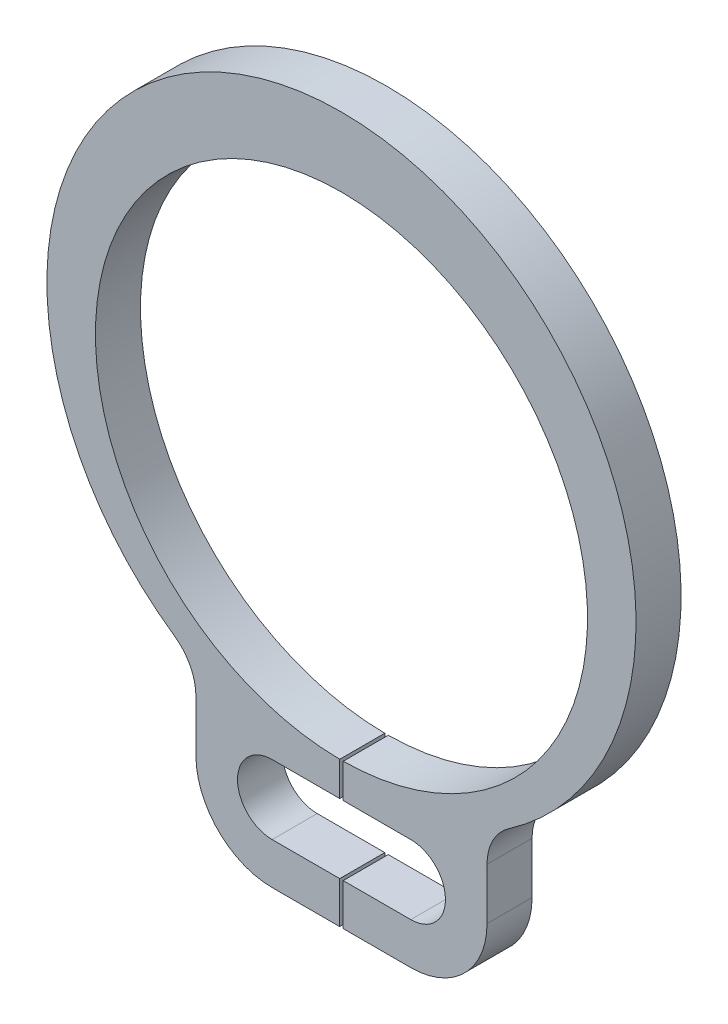
ISO-10303-21;
HEADER;
FILE_DESCRIPTION(('STEP AP214'),'2;1');
FILE_NAME('part.step','',(''),(''),'','','');
FILE_SCHEMA(('AUTOMOTIVE_DESIGN { 1 0 10303 214 1 1 1 1 }'));
ENDSEC;
DATA;
#1=APPLICATION_CONTEXT('core data for automotive mechanical design processes');
#2=APPLICATION_PROTOCOL_DEFINITION('international standard','automotive_design',2000,#1);
#3=PRODUCT_CONTEXT('',#1,'mechanical');
#4=PRODUCT('Part','Part','',(#3));
#5=PRODUCT_RELATED_PRODUCT_CATEGORY('part','',(#4));
#6=PRODUCT_DEFINITION_FORMATION('','',#4);
#7=PRODUCT_DEFINITION_CONTEXT('part definition',#1,'design');
#8=PRODUCT_DEFINITION('design','',#6,#7);
#9=PRODUCT_DEFINITION_SHAPE('','',#8);
#10=(LENGTH_UNIT() NAMED_UNIT(*) SI_UNIT(.MILLI.,.METRE.));
#11=(NAMED_UNIT(*) PLANE_ANGLE_UNIT() SI_UNIT($,.RADIAN.));
#12=(NAMED_UNIT(*) SI_UNIT($,.STERADIAN.) SOLID_ANGLE_UNIT());
#13=UNCERTAINTY_MEASURE_WITH_UNIT(LENGTH_MEASURE(1.E-05),#10,'distance_accuracy_value','');
#14=(GEOMETRIC_REPRESENTATION_CONTEXT(3) GLOBAL_UNCERTAINTY_ASSIGNED_CONTEXT((#13)) GLOBAL_UNIT_ASSIGNED_CONTEXT((#10,
#11,#12)) REPRESENTATION_CONTEXT('',''));
#15=CARTESIAN_POINT('',(0.,0.,0.));
#16=DIRECTION('',(0.,0.,1.));
#17=DIRECTION('',(1.,0.,0.));
#18=AXIS2_PLACEMENT_3D('',#15,#16,#17);
#19=CARTESIAN_POINT('',(1.,-4.54120028186382,0.65));
#20=DIRECTION('',(0.,0.,-1.));
#21=DIRECTION('',(-1.,0.,0.));
#22=AXIS2_PLACEMENT_3D('',#19,#20,#21);
#23=CYLINDRICAL_SURFACE('',#22,0.5);
#24=CARTESIAN_POINT('',(1.,-4.54120028186382,0.65));
#25=DIRECTION('',(0.,0.,1.));
#26=DIRECTION('',(-1.,0.,0.));
#27=AXIS2_PLACEMENT_3D('',#24,#25,#26);
#28=CIRCLE('',#27,0.5);
#29=CARTESIAN_POINT('',(1.,-5.04120028186382,0.65));
#30=VERTEX_POINT('',#29);
#31=CARTESIAN_POINT('',(1.,-4.04120028186381,0.65));
#32=VERTEX_POINT('',#31);
#33=EDGE_CURVE('E194',#30,#32,#28,.T.);
#34=ORIENTED_EDGE('',*,*,#33,.T.);
#35=DIRECTION('',(0.,0.,1.));
#36=VECTOR('',#35,1.);
#37=CARTESIAN_POINT('',(1.,-4.04120028186381,0.));
#38=LINE('',#37,#36);
#39=CARTESIAN_POINT('',(1.,-4.04120028186381,0.));
#40=VERTEX_POINT('',#39);
#41=EDGE_CURVE('E311',#40,#32,#38,.T.);
#42=ORIENTED_EDGE('',*,*,#41,.F.);
#43=CARTESIAN_POINT('',(1.,-4.54120028186382,0.));
#44=DIRECTION('',(0.,0.,1.));
#45=DIRECTION('',(-1.,0.,0.));
#46=AXIS2_PLACEMENT_3D('',#43,#44,#45);
#47=CIRCLE('',#46,0.5);
#48=CARTESIAN_POINT('',(1.,-5.04120028186382,0.));
#49=VERTEX_POINT('',#48);
#50=EDGE_CURVE('E199',#49,#40,#47,.T.);
#51=ORIENTED_EDGE('',*,*,#50,.F.);
#52=DIRECTION('',(0.,0.,1.));
#53=VECTOR('',#52,1.);
#54=CARTESIAN_POINT('',(1.,-5.04120028186382,0.));
#55=LINE('',#54,#53);
#56=EDGE_CURVE('E187',#49,#30,#55,.T.);
#57=ORIENTED_EDGE('',*,*,#56,.T.);
#58=EDGE_LOOP('',(#34,#42,#51,#57));
#59=FACE_BOUND('',#58,.T.);
#60=ADVANCED_FACE('F32',(#59),#23,.F.);
#61=CARTESIAN_POINT('',(0.025,-5.64120028186382,0.));
#62=DIRECTION('',(1.,0.,0.));
#63=DIRECTION('',(0.,0.,-1.));
#64=AXIS2_PLACEMENT_3D('',#61,#62,#63);
#65=PLANE('',#64);
#66=DIRECTION('',(0.,1.,0.));
#67=VECTOR('',#66,1.);
#68=CARTESIAN_POINT('',(0.025,-5.64120028186382,0.));
#69=LINE('',#68,#67);
#70=CARTESIAN_POINT('',(0.0250000000000001,-4.04120028186381,0.));
#71=VERTEX_POINT('',#70);
#72=CARTESIAN_POINT('',(0.025,-3.54991197073956,0.));
#73=VERTEX_POINT('',#72);
#74=EDGE_CURVE('E319',#71,#73,#69,.T.);
#75=ORIENTED_EDGE('',*,*,#74,.F.);
#76=DIRECTION('',(0.,0.,1.));
#77=VECTOR('',#76,1.);
#78=CARTESIAN_POINT('',(0.025,-4.04120028186381,0.));
#79=LINE('',#78,#77);
#80=CARTESIAN_POINT('',(0.025,-4.04120028186381,0.65));
#81=VERTEX_POINT('',#80);
#82=EDGE_CURVE('E287',#71,#81,#79,.T.);
#83=ORIENTED_EDGE('',*,*,#82,.T.);
#84=DIRECTION('',(0.,1.,0.));
#85=VECTOR('',#84,1.);
#86=CARTESIAN_POINT('',(0.025,-5.64120028186382,0.65));
#87=LINE('',#86,#85);
#88=CARTESIAN_POINT('',(0.025,-3.54991197073956,0.65));
#89=VERTEX_POINT('',#88);
#90=EDGE_CURVE('E290',#81,#89,#87,.T.);
#91=ORIENTED_EDGE('',*,*,#90,.T.);
#92=DIRECTION('',(0.,0.,-1.));
#93=VECTOR('',#92,1.);
#94=CARTESIAN_POINT('',(0.025,-3.54991197073956,0.65));
#95=LINE('',#94,#93);
#96=EDGE_CURVE('E254',#89,#73,#95,.T.);
#97=ORIENTED_EDGE('',*,*,#96,.T.);
#98=EDGE_LOOP('',(#75,#83,#91,#97));
#99=FACE_BOUND('',#98,.T.);
#100=ADVANCED_FACE('F381',(#99),#65,.F.);
#101=CARTESIAN_POINT('',(-0.025,-5.64120028186382,0.));
#102=DIRECTION('',(-1.,0.,0.));
#103=DIRECTION('',(0.,0.,1.));
#104=AXIS2_PLACEMENT_3D('',#101,#102,#103);
#105=PLANE('',#104);
#106=DIRECTION('',(0.,-1.,0.));
#107=VECTOR('',#106,1.);
#108=CARTESIAN_POINT('',(-0.025,-5.64120028186382,0.65));
#109=LINE('',#108,#107);
#110=CARTESIAN_POINT('',(-0.025,-3.54991197073956,0.65));
#111=VERTEX_POINT('',#110);
#112=CARTESIAN_POINT('',(-0.025,-4.04120028186381,0.65));
#113=VERTEX_POINT('',#112);
#114=EDGE_CURVE('E286',#111,#113,#109,.T.);
#115=ORIENTED_EDGE('',*,*,#114,.T.);
#116=DIRECTION('',(0.,0.,-1.));
#117=VECTOR('',#116,1.);
#118=CARTESIAN_POINT('',(-0.025,-4.04120028186381,0.));
#119=LINE('',#118,#117);
#120=CARTESIAN_POINT('',(-0.025,-4.04120028186381,0.));
#121=VERTEX_POINT('',#120);
#122=EDGE_CURVE('E11',#113,#121,#119,.T.);
#123=ORIENTED_EDGE('',*,*,#122,.T.);
#124=DIRECTION('',(0.,-1.,0.));
#125=VECTOR('',#124,1.);
#126=CARTESIAN_POINT('',(-0.025,-5.64120028186382,0.));
#127=LINE('',#126,#125);
#128=CARTESIAN_POINT('',(-0.025,-3.54991197073956,0.));
#129=VERTEX_POINT('',#128);
#130=EDGE_CURVE('E318',#129,#121,#127,.T.);
#131=ORIENTED_EDGE('',*,*,#130,.F.);
#132=DIRECTION('',(0.,0.,-1.));
#133=VECTOR('',#132,1.);
#134=CARTESIAN_POINT('',(-0.025,-3.54991197073956,0.65));
#135=LINE('',#134,#133);
#136=EDGE_CURVE('E257',#129,#111,#135,.F.);
#137=ORIENTED_EDGE('',*,*,#136,.T.);
#138=EDGE_LOOP('',(#115,#123,#131,#137));
#139=FACE_BOUND('',#138,.T.);
#140=ADVANCED_FACE('F374',(#139),#105,.F.);
#141=CARTESIAN_POINT('',(-0.999999999999999,-5.64120028186382,0.65));
#142=DIRECTION('',(0.,1.,0.));
#143=DIRECTION('',(0.,0.,1.));
#144=AXIS2_PLACEMENT_3D('',#141,#142,#143);
#145=PLANE('',#144);
#146=DIRECTION('',(1.,0.,0.));
#147=VECTOR('',#146,1.);
#148=CARTESIAN_POINT('',(-0.999999999999999,-5.64120028186382,0.));
#149=LINE('',#148,#147);
#150=CARTESIAN_POINT('',(-0.999999999999999,-5.64120028186382,0.));
#151=VERTEX_POINT('',#150);
#152=CARTESIAN_POINT('',(-0.025,-5.64120028186382,0.));
#153=VERTEX_POINT('',#152);
#154=EDGE_CURVE('E231',#151,#153,#149,.T.);
#155=ORIENTED_EDGE('',*,*,#154,.T.);
#156=DIRECTION('',(0.,0.,1.));
#157=VECTOR('',#156,1.);
#158=CARTESIAN_POINT('',(-0.025,-5.64120028186382,0.));
#159=LINE('',#158,#157);
#160=CARTESIAN_POINT('',(-0.025,-5.64120028186382,0.65));
#161=VERTEX_POINT('',#160);
#162=EDGE_CURVE('E302',#153,#161,#159,.T.);
#163=ORIENTED_EDGE('',*,*,#162,.T.);
#164=DIRECTION('',(1.,0.,0.));
#165=VECTOR('',#164,1.);
#166=CARTESIAN_POINT('',(-0.999999999999999,-5.64120028186382,0.65));
#167=LINE('',#166,#165);
#168=CARTESIAN_POINT('',(-0.999999999999999,-5.64120028186382,0.65));
#169=VERTEX_POINT('',#168);
#170=EDGE_CURVE('E214',#169,#161,#167,.T.);
#171=ORIENTED_EDGE('',*,*,#170,.F.);
#172=DIRECTION('',(0.,0.,-1.));
#173=VECTOR('',#172,1.);
#174=CARTESIAN_POINT('',(-0.999999999999999,-5.64120028186382,0.65));
#175=LINE('',#174,#173);
#176=EDGE_CURVE('E251',#169,#151,#175,.T.);
#177=ORIENTED_EDGE('',*,*,#176,.T.);
#178=EDGE_LOOP('',(#155,#163,#171,#177));
#179=FACE_BOUND('',#178,.T.);
#180=ADVANCED_FACE('F322',(#179),#145,.F.);
#181=CARTESIAN_POINT('',(-0.999999999999999,-4.54120028186382,0.65));
#182=DIRECTION('',(0.,0.,1.));
#183=DIRECTION('',(1.,0.,0.));
#184=AXIS2_PLACEMENT_3D('',#181,#182,#183);
#185=PLANE('',#184);
#186=DIRECTION('',(-1.,0.,0.));
#187=VECTOR('',#186,1.);
#188=CARTESIAN_POINT('',(-0.999999999999999,-4.04120028186381,0.65));
#189=LINE('',#188,#187);
#190=EDGE_CURVE('E47',#32,#81,#189,.T.);
#191=ORIENTED_EDGE('',*,*,#190,.F.);
#192=ORIENTED_EDGE('',*,*,#33,.F.);
#193=DIRECTION('',(1.,0.,0.));
#194=VECTOR('',#193,1.);
#195=CARTESIAN_POINT('',(-0.999999999999999,-5.04120028186382,0.65));
#196=LINE('',#195,#194);
#197=CARTESIAN_POINT('',(0.0250000000000001,-5.04120028186382,0.65));
#198=VERTEX_POINT('',#197);
#199=EDGE_CURVE('E364',#198,#30,#196,.T.);
#200=ORIENTED_EDGE('',*,*,#199,.F.);
#201=CARTESIAN_POINT('',(0.025,-5.64120028186382,0.65));
#202=VERTEX_POINT('',#201);
#203=EDGE_CURVE('E297',#202,#198,#87,.T.);
#204=ORIENTED_EDGE('',*,*,#203,.F.);
#205=CARTESIAN_POINT('',(1.,-5.64120028186382,0.65));
#206=VERTEX_POINT('',#205);
#207=EDGE_CURVE('E212',#202,#206,#167,.T.);
#208=ORIENTED_EDGE('',*,*,#207,.T.);
#209=CARTESIAN_POINT('',(1.,-4.54120028186382,0.65));
#210=DIRECTION('',(0.,0.,1.));
#211=DIRECTION('',(-1.,0.,0.));
#212=AXIS2_PLACEMENT_3D('',#209,#210,#211);
#213=CIRCLE('',#212,1.1);
#214=CARTESIAN_POINT('',(2.1,-4.54120028186381,0.65));
#215=VERTEX_POINT('',#214);
#216=EDGE_CURVE('E217',#206,#215,#213,.T.);
#217=ORIENTED_EDGE('',*,*,#216,.T.);
#218=DIRECTION('',(0.,1.,0.));
#219=VECTOR('',#218,1.);
#220=CARTESIAN_POINT('',(2.1,-4.54120028186381,0.65));
#221=LINE('',#220,#219);
#222=CARTESIAN_POINT('',(2.1,-3.79949183842746,0.65));
#223=VERTEX_POINT('',#222);
#224=EDGE_CURVE('E219',#215,#223,#221,.T.);
#225=ORIENTED_EDGE('',*,*,#224,.T.);
#226=CARTESIAN_POINT('',(2.83333333333333,-3.79949183842746,0.65));
#227=DIRECTION('',(0.,0.,1.));
#228=DIRECTION('',(1.,0.,0.));
#229=AXIS2_PLACEMENT_3D('',#226,#227,#228);
#230=CIRCLE('',#229,0.733333333333333);
#231=CARTESIAN_POINT('',(2.41638795986622,-3.19622213645151,0.65));
#232=VERTEX_POINT('',#231);
#233=EDGE_CURVE('E271',#223,#232,#230,.F.);
#234=ORIENTED_EDGE('',*,*,#233,.T.);
#235=CARTESIAN_POINT('',(0.,0.3,0.65));
#236=DIRECTION('',(0.,0.,1.));
#237=DIRECTION('',(1.,0.,0.));
#238=AXIS2_PLACEMENT_3D('',#235,#236,#237);
#239=CIRCLE('',#238,4.25);
#240=CARTESIAN_POINT('',(-2.41638795986622,-3.19622213645151,0.65));
#241=VERTEX_POINT('',#240);
#242=EDGE_CURVE('E222',#232,#241,#239,.T.);
#243=ORIENTED_EDGE('',*,*,#242,.T.);
#244=CARTESIAN_POINT('',(-2.83333333333333,-3.79949183842746,0.65));
#245=DIRECTION('',(0.,0.,1.));
#246=DIRECTION('',(1.,0.,0.));
#247=AXIS2_PLACEMENT_3D('',#244,#245,#246);
#248=CIRCLE('',#247,0.733333333333333);
#249=CARTESIAN_POINT('',(-2.1,-3.79949183842746,0.65));
#250=VERTEX_POINT('',#249);
#251=EDGE_CURVE('E275',#241,#250,#248,.F.);
#252=ORIENTED_EDGE('',*,*,#251,.T.);
#253=DIRECTION('',(0.,-1.,0.));
#254=VECTOR('',#253,1.);
#255=CARTESIAN_POINT('',(-2.1,-4.54120028186382,0.65));
#256=LINE('',#255,#254);
#257=CARTESIAN_POINT('',(-2.1,-4.54120028186382,0.65));
#258=VERTEX_POINT('',#257);
#259=EDGE_CURVE('E225',#250,#258,#256,.T.);
#260=ORIENTED_EDGE('',*,*,#259,.T.);
#261=CARTESIAN_POINT('',(-0.999999999999999,-4.54120028186382,0.65));
#262=DIRECTION('',(0.,0.,1.));
#263=DIRECTION('',(1.,0.,0.));
#264=AXIS2_PLACEMENT_3D('',#261,#262,#263);
#265=CIRCLE('',#264,1.1);
#266=EDGE_CURVE('E209',#258,#169,#265,.T.);
#267=ORIENTED_EDGE('',*,*,#266,.T.);
#268=ORIENTED_EDGE('',*,*,#170,.T.);
#269=CARTESIAN_POINT('',(-0.025,-5.04120028186382,0.65));
#270=VERTEX_POINT('',#269);
#271=EDGE_CURVE('E280',#270,#161,#109,.T.);
#272=ORIENTED_EDGE('',*,*,#271,.F.);
#273=CARTESIAN_POINT('',(-0.999999999999999,-5.04120028186382,0.65));
#274=VERTEX_POINT('',#273);
#275=EDGE_CURVE('E285',#274,#270,#196,.T.);
#276=ORIENTED_EDGE('',*,*,#275,.F.);
#277=CARTESIAN_POINT('',(-0.999999999999999,-4.54120028186382,0.65));
#278=DIRECTION('',(0.,0.,1.));
#279=DIRECTION('',(1.,0.,0.));
#280=AXIS2_PLACEMENT_3D('',#277,#278,#279);
#281=CIRCLE('',#280,0.5);
#282=CARTESIAN_POINT('',(-0.999999999999999,-4.04120028186381,0.65));
#283=VERTEX_POINT('',#282);
#284=EDGE_CURVE('E186',#283,#274,#281,.T.);
#285=ORIENTED_EDGE('',*,*,#284,.F.);
#286=EDGE_CURVE('E366',#113,#283,#189,.T.);
#287=ORIENTED_EDGE('',*,*,#286,.F.);
#288=ORIENTED_EDGE('',*,*,#114,.F.);
#289=CARTESIAN_POINT('',(0.,0.,0.65));
#290=DIRECTION('',(0.,0.,1.));
#291=DIRECTION('',(1.,0.,0.));
#292=AXIS2_PLACEMENT_3D('',#289,#290,#291);
#293=CIRCLE('',#292,3.55);
#294=EDGE_CURVE('E203',#89,#111,#293,.T.);
#295=ORIENTED_EDGE('',*,*,#294,.F.);
#296=ORIENTED_EDGE('',*,*,#90,.F.);
#297=EDGE_LOOP('',(#191,#192,#200,#204,#208,#217,#225,#234,#243,#252,#260,#267,#268,#272,#276,
#285,#287,#288,#295,#296));
#298=FACE_BOUND('',#297,.T.);
#299=ADVANCED_FACE('F284',(#298),#185,.T.);
#300=CARTESIAN_POINT('',(-0.999999999999999,-4.54120028186382,0.));
#301=DIRECTION('',(0.,0.,1.));
#302=DIRECTION('',(1.,0.,0.));
#303=AXIS2_PLACEMENT_3D('',#300,#301,#302);
#304=PLANE('',#303);
#305=ORIENTED_EDGE('',*,*,#50,.T.);
#306=DIRECTION('',(-1.,0.,0.));
#307=VECTOR('',#306,1.);
#308=CARTESIAN_POINT('',(-0.999999999999999,-4.04120028186381,0.));
#309=LINE('',#308,#307);
#310=EDGE_CURVE('E188',#40,#71,#309,.T.);
#311=ORIENTED_EDGE('',*,*,#310,.T.);
#312=ORIENTED_EDGE('',*,*,#74,.T.);
#313=CARTESIAN_POINT('',(0.,0.,0.));
#314=DIRECTION('',(0.,0.,1.));
#315=DIRECTION('',(1.,0.,0.));
#316=AXIS2_PLACEMENT_3D('',#313,#314,#315);
#317=CIRCLE('',#316,3.55);
#318=EDGE_CURVE('E196',#73,#129,#317,.T.);
#319=ORIENTED_EDGE('',*,*,#318,.T.);
#320=ORIENTED_EDGE('',*,*,#130,.T.);
#321=CARTESIAN_POINT('',(-0.999999999999999,-4.04120028186381,0.));
#322=VERTEX_POINT('',#321);
#323=EDGE_CURVE('E177',#121,#322,#309,.T.);
#324=ORIENTED_EDGE('',*,*,#323,.T.);
#325=CARTESIAN_POINT('',(-0.999999999999999,-4.54120028186382,0.));
#326=DIRECTION('',(0.,0.,1.));
#327=DIRECTION('',(1.,0.,0.));
#328=AXIS2_PLACEMENT_3D('',#325,#326,#327);
#329=CIRCLE('',#328,0.5);
#330=CARTESIAN_POINT('',(-0.999999999999999,-5.04120028186382,0.));
#331=VERTEX_POINT('',#330);
#332=EDGE_CURVE('E184',#322,#331,#329,.T.);
#333=ORIENTED_EDGE('',*,*,#332,.T.);
#334=DIRECTION('',(1.,0.,0.));
#335=VECTOR('',#334,1.);
#336=CARTESIAN_POINT('',(-0.999999999999999,-5.04120028186382,0.));
#337=LINE('',#336,#335);
#338=CARTESIAN_POINT('',(-0.025,-5.04120028186382,0.));
#339=VERTEX_POINT('',#338);
#340=EDGE_CURVE('E168',#331,#339,#337,.T.);
#341=ORIENTED_EDGE('',*,*,#340,.T.);
#342=EDGE_CURVE('E282',#339,#153,#127,.T.);
#343=ORIENTED_EDGE('',*,*,#342,.T.);
#344=ORIENTED_EDGE('',*,*,#154,.F.);
#345=CARTESIAN_POINT('',(-0.999999999999999,-4.54120028186382,0.));
#346=DIRECTION('',(0.,0.,1.));
#347=DIRECTION('',(1.,0.,0.));
#348=AXIS2_PLACEMENT_3D('',#345,#346,#347);
#349=CIRCLE('',#348,1.1);
#350=CARTESIAN_POINT('',(-2.1,-4.54120028186382,0.));
#351=VERTEX_POINT('',#350);
#352=EDGE_CURVE('E206',#351,#151,#349,.T.);
#353=ORIENTED_EDGE('',*,*,#352,.F.);
#354=DIRECTION('',(0.,-1.,0.));
#355=VECTOR('',#354,1.);
#356=CARTESIAN_POINT('',(-2.1,-4.54120028186382,0.));
#357=LINE('',#356,#355);
#358=CARTESIAN_POINT('',(-2.1,-3.79949183842746,0.));
#359=VERTEX_POINT('',#358);
#360=EDGE_CURVE('E213',#359,#351,#357,.T.);
#361=ORIENTED_EDGE('',*,*,#360,.F.);
#362=CARTESIAN_POINT('',(-2.83333333333333,-3.79949183842746,0.));
#363=DIRECTION('',(0.,0.,1.));
#364=DIRECTION('',(1.,0.,0.));
#365=AXIS2_PLACEMENT_3D('',#362,#363,#364);
#366=CIRCLE('',#365,0.733333333333333);
#367=CARTESIAN_POINT('',(-2.41638795986622,-3.19622213645151,0.));
#368=VERTEX_POINT('',#367);
#369=EDGE_CURVE('E273',#359,#368,#366,.T.);
#370=ORIENTED_EDGE('',*,*,#369,.T.);
#371=CARTESIAN_POINT('',(0.,0.3,0.));
#372=DIRECTION('',(0.,0.,1.));
#373=DIRECTION('',(1.,0.,0.));
#374=AXIS2_PLACEMENT_3D('',#371,#372,#373);
#375=CIRCLE('',#374,4.25);
#376=CARTESIAN_POINT('',(2.41638795986622,-3.19622213645151,0.));
#377=VERTEX_POINT('',#376);
#378=EDGE_CURVE('E239',#377,#368,#375,.T.);
#379=ORIENTED_EDGE('',*,*,#378,.F.);
#380=CARTESIAN_POINT('',(2.83333333333333,-3.79949183842746,0.));
#381=DIRECTION('',(0.,0.,1.));
#382=DIRECTION('',(1.,0.,0.));
#383=AXIS2_PLACEMENT_3D('',#380,#381,#382);
#384=CIRCLE('',#383,0.733333333333333);
#385=CARTESIAN_POINT('',(2.1,-3.79949183842746,0.));
#386=VERTEX_POINT('',#385);
#387=EDGE_CURVE('E269',#377,#386,#384,.T.);
#388=ORIENTED_EDGE('',*,*,#387,.T.);
#389=DIRECTION('',(0.,1.,0.));
#390=VECTOR('',#389,1.);
#391=CARTESIAN_POINT('',(2.1,-4.54120028186381,0.));
#392=LINE('',#391,#390);
#393=CARTESIAN_POINT('',(2.1,-4.54120028186381,0.));
#394=VERTEX_POINT('',#393);
#395=EDGE_CURVE('E236',#394,#386,#392,.T.);
#396=ORIENTED_EDGE('',*,*,#395,.F.);
#397=CARTESIAN_POINT('',(1.,-4.54120028186382,0.));
#398=DIRECTION('',(0.,0.,1.));
#399=DIRECTION('',(-1.,0.,0.));
#400=AXIS2_PLACEMENT_3D('',#397,#398,#399);
#401=CIRCLE('',#400,1.1);
#402=CARTESIAN_POINT('',(1.,-5.64120028186382,0.));
#403=VERTEX_POINT('',#402);
#404=EDGE_CURVE('E234',#403,#394,#401,.T.);
#405=ORIENTED_EDGE('',*,*,#404,.F.);
#406=CARTESIAN_POINT('',(0.025,-5.64120028186382,0.));
#407=VERTEX_POINT('',#406);
#408=EDGE_CURVE('E230',#407,#403,#149,.T.);
#409=ORIENTED_EDGE('',*,*,#408,.F.);
#410=CARTESIAN_POINT('',(0.025,-5.04120028186382,0.));
#411=VERTEX_POINT('',#410);
#412=EDGE_CURVE('E295',#407,#411,#69,.T.);
#413=ORIENTED_EDGE('',*,*,#412,.T.);
#414=EDGE_CURVE('E55',#411,#49,#337,.T.);
#415=ORIENTED_EDGE('',*,*,#414,.T.);
#416=EDGE_LOOP('',(#305,#311,#312,#319,#320,#324,#333,#341,#343,#344,#353,#361,#370,#379,#388,
#396,#405,#409,#413,#415));
#417=FACE_BOUND('',#416,.T.);
#418=ADVANCED_FACE('F192',(#417),#304,.F.);
#419=CARTESIAN_POINT('',(-0.999999999999999,-4.54120028186382,0.65));
#420=DIRECTION('',(0.,0.,-1.));
#421=DIRECTION('',(-1.,0.,0.));
#422=AXIS2_PLACEMENT_3D('',#419,#420,#421);
#423=CYLINDRICAL_SURFACE('',#422,1.1);
#424=ORIENTED_EDGE('',*,*,#352,.T.);
#425=ORIENTED_EDGE('',*,*,#176,.F.);
#426=ORIENTED_EDGE('',*,*,#266,.F.);
#427=DIRECTION('',(0.,0.,-1.));
#428=VECTOR('',#427,1.);
#429=CARTESIAN_POINT('',(-2.1,-4.54120028186382,0.65));
#430=LINE('',#429,#428);
#431=EDGE_CURVE('E227',#258,#351,#430,.T.);
#432=ORIENTED_EDGE('',*,*,#431,.T.);
#433=EDGE_LOOP('',(#424,#425,#426,#432));
#434=FACE_BOUND('',#433,.T.);
#435=ADVANCED_FACE('F326',(#434),#423,.T.);
#436=ORIENTED_EDGE('',*,*,#207,.F.);
#437=DIRECTION('',(0.,0.,1.));
#438=VECTOR('',#437,1.);
#439=CARTESIAN_POINT('',(0.025,-5.64120028186382,0.));
#440=LINE('',#439,#438);
#441=EDGE_CURVE('E300',#407,#202,#440,.T.);
#442=ORIENTED_EDGE('',*,*,#441,.F.);
#443=ORIENTED_EDGE('',*,*,#408,.T.);
#444=DIRECTION('',(0.,0.,-1.));
#445=VECTOR('',#444,1.);
#446=CARTESIAN_POINT('',(1.,-5.64120028186382,0.65));
#447=LINE('',#446,#445);
#448=EDGE_CURVE('E248',#206,#403,#447,.T.);
#449=ORIENTED_EDGE('',*,*,#448,.F.);
#450=EDGE_LOOP('',(#436,#442,#443,#449));
#451=FACE_BOUND('',#450,.T.);
#452=ADVANCED_FACE('F359',(#451),#145,.F.);
#453=CARTESIAN_POINT('',(1.,-4.54120028186382,0.65));
#454=DIRECTION('',(0.,0.,-1.));
#455=DIRECTION('',(-1.,0.,0.));
#456=AXIS2_PLACEMENT_3D('',#453,#454,#455);
#457=CYLINDRICAL_SURFACE('',#456,1.1);
#458=ORIENTED_EDGE('',*,*,#404,.T.);
#459=DIRECTION('',(0.,0.,-1.));
#460=VECTOR('',#459,1.);
#461=CARTESIAN_POINT('',(2.1,-4.54120028186381,0.65));
#462=LINE('',#461,#460);
#463=EDGE_CURVE('E245',#215,#394,#462,.T.);
#464=ORIENTED_EDGE('',*,*,#463,.F.);
#465=ORIENTED_EDGE('',*,*,#216,.F.);
#466=ORIENTED_EDGE('',*,*,#448,.T.);
#467=EDGE_LOOP('',(#458,#464,#465,#466));
#468=FACE_BOUND('',#467,.T.);
#469=ADVANCED_FACE('F353',(#468),#457,.T.);
#470=CARTESIAN_POINT('',(2.1,-4.54120028186381,0.65));
#471=DIRECTION('',(-1.,0.,0.));
#472=DIRECTION('',(0.,-1.,0.));
#473=AXIS2_PLACEMENT_3D('',#470,#471,#472);
#474=PLANE('',#473);
#475=ORIENTED_EDGE('',*,*,#395,.T.);
#476=DIRECTION('',(0.,0.,1.));
#477=VECTOR('',#476,1.);
#478=CARTESIAN_POINT('',(2.1,-3.79949183842746,0.65));
#479=LINE('',#478,#477);
#480=EDGE_CURVE('E264',#386,#223,#479,.T.);
#481=ORIENTED_EDGE('',*,*,#480,.T.);
#482=ORIENTED_EDGE('',*,*,#224,.F.);
#483=ORIENTED_EDGE('',*,*,#463,.T.);
#484=EDGE_LOOP('',(#475,#481,#482,#483));
#485=FACE_BOUND('',#484,.T.);
#486=ADVANCED_FACE('F349',(#485),#474,.F.);
#487=CARTESIAN_POINT('',(0.,0.3,0.65));
#488=DIRECTION('',(0.,0.,-1.));
#489=DIRECTION('',(-1.,0.,0.));
#490=AXIS2_PLACEMENT_3D('',#487,#488,#489);
#491=CYLINDRICAL_SURFACE('',#490,4.25);
#492=ORIENTED_EDGE('',*,*,#242,.F.);
#493=DIRECTION('',(0.,0.,-1.));
#494=VECTOR('',#493,1.);
#495=CARTESIAN_POINT('',(2.41638795986622,-3.19622213645151,0.65));
#496=LINE('',#495,#494);
#497=EDGE_CURVE('E261',#232,#377,#496,.T.);
#498=ORIENTED_EDGE('',*,*,#497,.T.);
#499=ORIENTED_EDGE('',*,*,#378,.T.);
#500=DIRECTION('',(0.,0.,-1.));
#501=VECTOR('',#500,1.);
#502=CARTESIAN_POINT('',(-2.41638795986622,-3.19622213645151,0.65));
#503=LINE('',#502,#501);
#504=EDGE_CURVE('E259',#368,#241,#503,.F.);
#505=ORIENTED_EDGE('',*,*,#504,.T.);
#506=EDGE_LOOP('',(#492,#498,#499,#505));
#507=FACE_BOUND('',#506,.T.);
#508=ADVANCED_FACE('F339',(#507),#491,.T.);
#509=CARTESIAN_POINT('',(-2.1,-4.54120028186382,0.65));
#510=DIRECTION('',(1.,0.,0.));
#511=DIRECTION('',(0.,0.,-1.));
#512=AXIS2_PLACEMENT_3D('',#509,#510,#511);
#513=PLANE('',#512);
#514=ORIENTED_EDGE('',*,*,#259,.F.);
#515=DIRECTION('',(0.,0.,1.));
#516=VECTOR('',#515,1.);
#517=CARTESIAN_POINT('',(-2.1,-3.79949183842746,0.));
#518=LINE('',#517,#516);
#519=EDGE_CURVE('E266',#250,#359,#518,.F.);
#520=ORIENTED_EDGE('',*,*,#519,.T.);
#521=ORIENTED_EDGE('',*,*,#360,.T.);
#522=ORIENTED_EDGE('',*,*,#431,.F.);
#523=EDGE_LOOP('',(#514,#520,#521,#522));
#524=FACE_BOUND('',#523,.T.);
#525=ADVANCED_FACE('F332',(#524),#513,.F.);
#526=CARTESIAN_POINT('',(0.,0.,0.65));
#527=DIRECTION('',(0.,0.,-1.));
#528=DIRECTION('',(-1.,0.,0.));
#529=AXIS2_PLACEMENT_3D('',#526,#527,#528);
#530=CYLINDRICAL_SURFACE('',#529,3.55);
#531=ORIENTED_EDGE('',*,*,#136,.F.);
#532=ORIENTED_EDGE('',*,*,#318,.F.);
#533=ORIENTED_EDGE('',*,*,#96,.F.);
#534=ORIENTED_EDGE('',*,*,#294,.T.);
#535=EDGE_LOOP('',(#531,#532,#533,#534));
#536=FACE_BOUND('',#535,.T.);
#537=ADVANCED_FACE('F378',(#536),#530,.F.);
#538=CARTESIAN_POINT('',(-0.999999999999999,-4.54120028186382,0.65));
#539=DIRECTION('',(0.,0.,-1.));
#540=DIRECTION('',(-1.,0.,0.));
#541=AXIS2_PLACEMENT_3D('',#538,#539,#540);
#542=CYLINDRICAL_SURFACE('',#541,0.5);
#543=DIRECTION('',(0.,0.,1.));
#544=VECTOR('',#543,1.);
#545=CARTESIAN_POINT('',(-0.999999999999999,-4.04120028186381,0.));
#546=LINE('',#545,#544);
#547=EDGE_CURVE('E312',#322,#283,#546,.T.);
#548=ORIENTED_EDGE('',*,*,#547,.T.);
#549=ORIENTED_EDGE('',*,*,#284,.T.);
#550=DIRECTION('',(0.,0.,1.));
#551=VECTOR('',#550,1.);
#552=CARTESIAN_POINT('',(-0.999999999999999,-5.04120028186382,0.));
#553=LINE('',#552,#551);
#554=EDGE_CURVE('E171',#331,#274,#553,.T.);
#555=ORIENTED_EDGE('',*,*,#554,.F.);
#556=ORIENTED_EDGE('',*,*,#332,.F.);
#557=EDGE_LOOP('',(#548,#549,#555,#556));
#558=FACE_BOUND('',#557,.T.);
#559=ADVANCED_FACE('F183',(#558),#542,.F.);
#560=ORIENTED_EDGE('',*,*,#203,.T.);
#561=DIRECTION('',(0.,0.,-1.));
#562=VECTOR('',#561,1.);
#563=CARTESIAN_POINT('',(0.025,-5.04120028186382,0.));
#564=LINE('',#563,#562);
#565=EDGE_CURVE('E291',#198,#411,#564,.T.);
#566=ORIENTED_EDGE('',*,*,#565,.T.);
#567=ORIENTED_EDGE('',*,*,#412,.F.);
#568=ORIENTED_EDGE('',*,*,#441,.T.);
#569=EDGE_LOOP('',(#560,#566,#567,#568));
#570=FACE_BOUND('',#569,.T.);
#571=ADVANCED_FACE('F362',(#570),#65,.F.);
#572=ORIENTED_EDGE('',*,*,#342,.F.);
#573=DIRECTION('',(0.,0.,1.));
#574=VECTOR('',#573,1.);
#575=CARTESIAN_POINT('',(-0.025,-5.04120028186382,0.));
#576=LINE('',#575,#574);
#577=EDGE_CURVE('E40',#339,#270,#576,.T.);
#578=ORIENTED_EDGE('',*,*,#577,.T.);
#579=ORIENTED_EDGE('',*,*,#271,.T.);
#580=ORIENTED_EDGE('',*,*,#162,.F.);
#581=EDGE_LOOP('',(#572,#578,#579,#580));
#582=FACE_BOUND('',#581,.T.);
#583=ADVANCED_FACE('F278',(#582),#105,.F.);
#584=CARTESIAN_POINT('',(2.83333333333333,-3.79949183842746,0.65));
#585=DIRECTION('',(0.,0.,-1.));
#586=DIRECTION('',(-1.,0.,0.));
#587=AXIS2_PLACEMENT_3D('',#584,#585,#586);
#588=CYLINDRICAL_SURFACE('',#587,0.733333333333333);
#589=ORIENTED_EDGE('',*,*,#233,.F.);
#590=ORIENTED_EDGE('',*,*,#480,.F.);
#591=ORIENTED_EDGE('',*,*,#387,.F.);
#592=ORIENTED_EDGE('',*,*,#497,.F.);
#593=EDGE_LOOP('',(#589,#590,#591,#592));
#594=FACE_BOUND('',#593,.T.);
#595=ADVANCED_FACE('F345',(#594),#588,.F.);
#596=CARTESIAN_POINT('',(-2.83333333333333,-3.79949183842746,0.65));
#597=DIRECTION('',(0.,0.,-1.));
#598=DIRECTION('',(-1.,0.,0.));
#599=AXIS2_PLACEMENT_3D('',#596,#597,#598);
#600=CYLINDRICAL_SURFACE('',#599,0.733333333333333);
#601=ORIENTED_EDGE('',*,*,#251,.F.);
#602=ORIENTED_EDGE('',*,*,#504,.F.);
#603=ORIENTED_EDGE('',*,*,#369,.F.);
#604=ORIENTED_EDGE('',*,*,#519,.F.);
#605=EDGE_LOOP('',(#601,#602,#603,#604));
#606=FACE_BOUND('',#605,.T.);
#607=ADVANCED_FACE('F34',(#606),#600,.F.);
#608=CARTESIAN_POINT('',(-0.999999999999999,-5.04120028186382,0.));
#609=DIRECTION('',(0.,-1.,0.));
#610=DIRECTION('',(0.,0.,-1.));
#611=AXIS2_PLACEMENT_3D('',#608,#609,#610);
#612=PLANE('',#611);
#613=ORIENTED_EDGE('',*,*,#340,.F.);
#614=ORIENTED_EDGE('',*,*,#554,.T.);
#615=ORIENTED_EDGE('',*,*,#275,.T.);
#616=ORIENTED_EDGE('',*,*,#577,.F.);
#617=EDGE_LOOP('',(#613,#614,#615,#616));
#618=FACE_BOUND('',#617,.T.);
#619=ADVANCED_FACE('F170',(#618),#612,.F.);
#620=CARTESIAN_POINT('',(-0.999999999999999,-4.04120028186381,0.));
#621=DIRECTION('',(0.,1.,0.));
#622=DIRECTION('',(0.,0.,1.));
#623=AXIS2_PLACEMENT_3D('',#620,#621,#622);
#624=PLANE('',#623);
#625=ORIENTED_EDGE('',*,*,#286,.T.);
#626=ORIENTED_EDGE('',*,*,#547,.F.);
#627=ORIENTED_EDGE('',*,*,#323,.F.);
#628=ORIENTED_EDGE('',*,*,#122,.F.);
#629=EDGE_LOOP('',(#625,#626,#627,#628));
#630=FACE_BOUND('',#629,.T.);
#631=ADVANCED_FACE('F370',(#630),#624,.F.);
#632=ORIENTED_EDGE('',*,*,#199,.T.);
#633=ORIENTED_EDGE('',*,*,#56,.F.);
#634=ORIENTED_EDGE('',*,*,#414,.F.);
#635=ORIENTED_EDGE('',*,*,#565,.F.);
#636=EDGE_LOOP('',(#632,#633,#634,#635));
#637=FACE_BOUND('',#636,.T.);
#638=ADVANCED_FACE('F385',(#637),#612,.F.);
#639=ORIENTED_EDGE('',*,*,#310,.F.);
#640=ORIENTED_EDGE('',*,*,#41,.T.);
#641=ORIENTED_EDGE('',*,*,#190,.T.);
#642=ORIENTED_EDGE('',*,*,#82,.F.);
#643=EDGE_LOOP('',(#639,#640,#641,#642));
#644=FACE_BOUND('',#643,.T.);
#645=ADVANCED_FACE('F383',(#644),#624,.F.);
#646=CLOSED_SHELL('',(#60,#100,#140,#180,#299,#418,#435,#452,#469,#486,#508,#525,#537,#559,#571,
#583,#595,#607,#619,#631,#638,#645));
#647=MANIFOLD_SOLID_BREP('B2',#646);
#648=ADVANCED_BREP_SHAPE_REPRESENTATION('',(#18,#647),#14);
#649=SHAPE_DEFINITION_REPRESENTATION(#9,#648);
ENDSEC;
END-ISO-10303-21;
